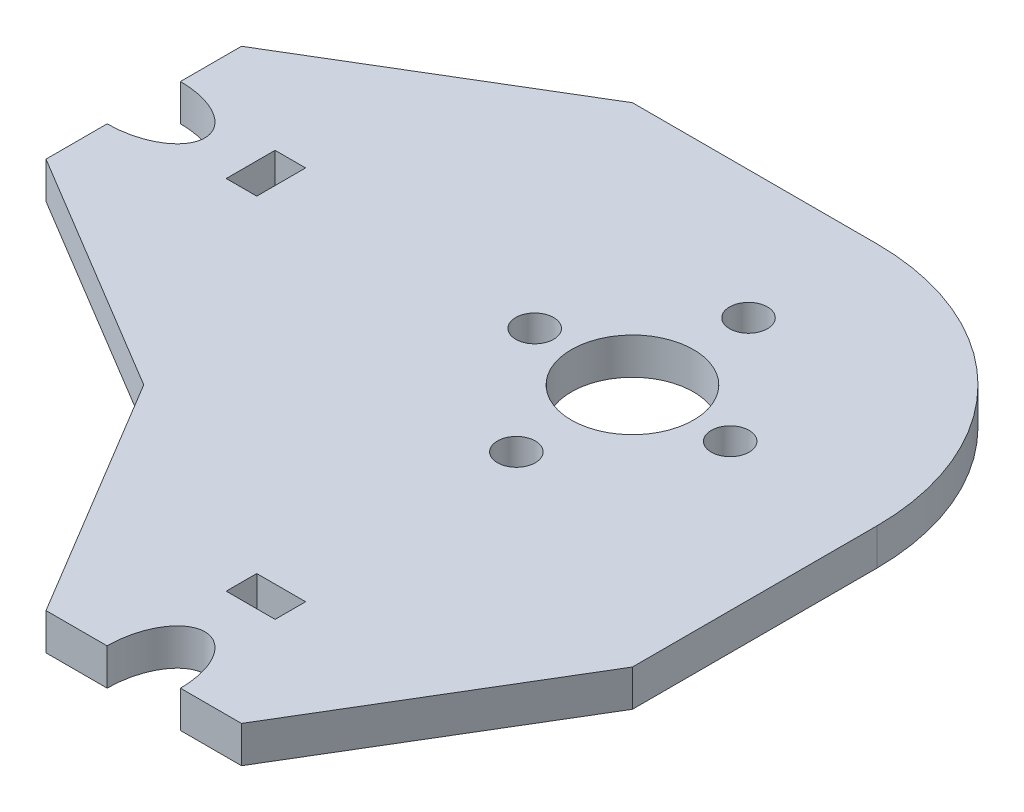
ISO-10303-21;
HEADER;
FILE_DESCRIPTION(('STEP AP214'),'2;1');
FILE_NAME('part.step','',(''),(''),'','','');
FILE_SCHEMA(('AUTOMOTIVE_DESIGN { 1 0 10303 214 1 1 1 1 }'));
ENDSEC;
DATA;
#1=APPLICATION_CONTEXT('core data for automotive mechanical design processes');
#2=APPLICATION_PROTOCOL_DEFINITION('international standard','automotive_design',2000,#1);
#3=PRODUCT_CONTEXT('',#1,'mechanical');
#4=PRODUCT('Part','Part','',(#3));
#5=PRODUCT_RELATED_PRODUCT_CATEGORY('part','',(#4));
#6=PRODUCT_DEFINITION_FORMATION('','',#4);
#7=PRODUCT_DEFINITION_CONTEXT('part definition',#1,'design');
#8=PRODUCT_DEFINITION('design','',#6,#7);
#9=PRODUCT_DEFINITION_SHAPE('','',#8);
#10=(LENGTH_UNIT() NAMED_UNIT(*) SI_UNIT(.MILLI.,.METRE.));
#11=(NAMED_UNIT(*) PLANE_ANGLE_UNIT() SI_UNIT($,.RADIAN.));
#12=(NAMED_UNIT(*) SI_UNIT($,.STERADIAN.) SOLID_ANGLE_UNIT());
#13=UNCERTAINTY_MEASURE_WITH_UNIT(LENGTH_MEASURE(1.E-05),#10,'distance_accuracy_value','');
#14=(GEOMETRIC_REPRESENTATION_CONTEXT(3) GLOBAL_UNCERTAINTY_ASSIGNED_CONTEXT((#13)) GLOBAL_UNIT_ASSIGNED_CONTEXT((#10,
#11,#12)) REPRESENTATION_CONTEXT('',''));
#15=CARTESIAN_POINT('',(0.,0.,0.));
#16=DIRECTION('',(0.,0.,1.));
#17=DIRECTION('',(1.,0.,0.));
#18=AXIS2_PLACEMENT_3D('',#15,#16,#17);
#19=CARTESIAN_POINT('',(1.66533453693774E-13,3.,40.));
#20=DIRECTION('',(0.,0.,1.));
#21=DIRECTION('',(1.,0.,0.));
#22=AXIS2_PLACEMENT_3D('',#19,#20,#21);
#23=PLANE('',#22);
#24=DIRECTION('',(-1.,0.,0.));
#25=VECTOR('',#24,1.);
#26=CARTESIAN_POINT('',(1.66533453693774E-13,0.,40.));
#27=LINE('',#26,#25);
#28=CARTESIAN_POINT('',(-2.99999999999982,0.,40.));
#29=VERTEX_POINT('',#28);
#30=CARTESIAN_POINT('',(-7.9999999999998,0.,40.));
#31=VERTEX_POINT('',#30);
#32=EDGE_CURVE('E300',#29,#31,#27,.T.);
#33=ORIENTED_EDGE('',*,*,#32,.F.);
#34=DIRECTION('',(0.,-1.,0.));
#35=VECTOR('',#34,1.);
#36=CARTESIAN_POINT('',(-2.99999999999982,3.,40.));
#37=LINE('',#36,#35);
#38=CARTESIAN_POINT('',(-2.99999999999982,3.,40.));
#39=VERTEX_POINT('',#38);
#40=EDGE_CURVE('E11',#39,#29,#37,.T.);
#41=ORIENTED_EDGE('',*,*,#40,.F.);
#42=DIRECTION('',(-1.,0.,0.));
#43=VECTOR('',#42,1.);
#44=CARTESIAN_POINT('',(1.66533453693774E-13,3.,40.));
#45=LINE('',#44,#43);
#46=CARTESIAN_POINT('',(-7.9999999999998,3.,40.));
#47=VERTEX_POINT('',#46);
#48=EDGE_CURVE('E372',#39,#47,#45,.T.);
#49=ORIENTED_EDGE('',*,*,#48,.T.);
#50=DIRECTION('',(0.,-1.,0.));
#51=VECTOR('',#50,1.);
#52=CARTESIAN_POINT('',(-7.9999999999998,3.,40.));
#53=LINE('',#52,#51);
#54=EDGE_CURVE('E55',#47,#31,#53,.T.);
#55=ORIENTED_EDGE('',*,*,#54,.T.);
#56=EDGE_LOOP('',(#33,#41,#49,#55));
#57=FACE_BOUND('',#56,.T.);
#58=ADVANCED_FACE('F36',(#57),#23,.T.);
#59=CARTESIAN_POINT('',(1.80411241501588E-13,3.,40.));
#60=DIRECTION('',(0.,-1.,0.));
#61=DIRECTION('',(0.,0.,-1.));
#62=AXIS2_PLACEMENT_3D('',#59,#60,#61);
#63=ELLIPSE('',#62,5.,3.);
#64=DIRECTION('',(0.,-1.,0.));
#65=VECTOR('',#64,1.);
#66=SURFACE_OF_LINEAR_EXTRUSION('',#63,#65);
#67=CARTESIAN_POINT('',(1.80411241501588E-13,0.,40.));
#68=DIRECTION('',(0.,-1.,0.));
#69=DIRECTION('',(0.,0.,-1.));
#70=AXIS2_PLACEMENT_3D('',#67,#68,#69);
#71=ELLIPSE('',#70,5.,3.);
#72=CARTESIAN_POINT('',(3.00000000000018,0.,40.));
#73=VERTEX_POINT('',#72);
#74=EDGE_CURVE('E302',#29,#73,#71,.T.);
#75=ORIENTED_EDGE('',*,*,#74,.T.);
#76=DIRECTION('',(0.,-1.,0.));
#77=VECTOR('',#76,1.);
#78=CARTESIAN_POINT('',(3.00000000000018,3.,40.));
#79=LINE('',#78,#77);
#80=CARTESIAN_POINT('',(3.00000000000018,3.,40.));
#81=VERTEX_POINT('',#80);
#82=EDGE_CURVE('E46',#81,#73,#79,.T.);
#83=ORIENTED_EDGE('',*,*,#82,.F.);
#84=EDGE_CURVE('E374',#39,#81,#63,.T.);
#85=ORIENTED_EDGE('',*,*,#84,.F.);
#86=ORIENTED_EDGE('',*,*,#40,.T.);
#87=EDGE_LOOP('',(#75,#83,#85,#86));
#88=FACE_BOUND('',#87,.T.);
#89=ADVANCED_FACE('F381',(#88),#66,.F.);
#90=CARTESIAN_POINT('',(1.11022302462516E-13,3.,40.));
#91=DIRECTION('',(0.,0.,-1.));
#92=DIRECTION('',(-1.,0.,0.));
#93=AXIS2_PLACEMENT_3D('',#90,#91,#92);
#94=PLANE('',#93);
#95=DIRECTION('',(1.,0.,0.));
#96=VECTOR('',#95,1.);
#97=CARTESIAN_POINT('',(1.11022302462516E-13,0.,40.));
#98=LINE('',#97,#96);
#99=CARTESIAN_POINT('',(8.00000000000018,0.,40.));
#100=VERTEX_POINT('',#99);
#101=EDGE_CURVE('E305',#73,#100,#98,.T.);
#102=ORIENTED_EDGE('',*,*,#101,.T.);
#103=DIRECTION('',(0.,-1.,0.));
#104=VECTOR('',#103,1.);
#105=CARTESIAN_POINT('',(8.00000000000018,3.,40.));
#106=LINE('',#105,#104);
#107=CARTESIAN_POINT('',(8.00000000000018,3.,40.));
#108=VERTEX_POINT('',#107);
#109=EDGE_CURVE('E228',#108,#100,#106,.T.);
#110=ORIENTED_EDGE('',*,*,#109,.F.);
#111=DIRECTION('',(1.,0.,0.));
#112=VECTOR('',#111,1.);
#113=CARTESIAN_POINT('',(1.11022302462516E-13,3.,40.));
#114=LINE('',#113,#112);
#115=EDGE_CURVE('E378',#81,#108,#114,.T.);
#116=ORIENTED_EDGE('',*,*,#115,.F.);
#117=ORIENTED_EDGE('',*,*,#82,.T.);
#118=EDGE_LOOP('',(#102,#110,#116,#117));
#119=FACE_BOUND('',#118,.T.);
#120=ADVANCED_FACE('F385',(#119),#94,.F.);
#121=CARTESIAN_POINT('',(23.5294117647059,3.,14.1176470588234));
#122=DIRECTION('',(-0.857492925712546,0.,-0.514495755427523));
#123=DIRECTION('',(-0.514495755427523,0.,0.857492925712547));
#124=AXIS2_PLACEMENT_3D('',#121,#122,#123);
#125=PLANE('',#124);
#126=DIRECTION('',(0.514495755427523,0.,-0.857492925712547));
#127=VECTOR('',#126,1.);
#128=CARTESIAN_POINT('',(23.5294117647059,0.,14.1176470588234));
#129=LINE('',#128,#127);
#130=CARTESIAN_POINT('',(20.0000000000001,0.,19.9999999999999));
#131=VERTEX_POINT('',#130);
#132=EDGE_CURVE('E308',#100,#131,#129,.T.);
#133=ORIENTED_EDGE('',*,*,#132,.T.);
#134=DIRECTION('',(0.,-1.,0.));
#135=VECTOR('',#134,1.);
#136=CARTESIAN_POINT('',(20.0000000000001,3.,19.9999999999999));
#137=LINE('',#136,#135);
#138=CARTESIAN_POINT('',(20.0000000000001,3.,19.9999999999999));
#139=VERTEX_POINT('',#138);
#140=EDGE_CURVE('E225',#139,#131,#137,.T.);
#141=ORIENTED_EDGE('',*,*,#140,.F.);
#142=DIRECTION('',(0.514495755427523,0.,-0.857492925712547));
#143=VECTOR('',#142,1.);
#144=CARTESIAN_POINT('',(23.5294117647059,3.,14.1176470588234));
#145=LINE('',#144,#143);
#146=EDGE_CURVE('E651',#108,#139,#145,.T.);
#147=ORIENTED_EDGE('',*,*,#146,.F.);
#148=ORIENTED_EDGE('',*,*,#109,.T.);
#149=EDGE_LOOP('',(#133,#141,#147,#148));
#150=FACE_BOUND('',#149,.T.);
#151=ADVANCED_FACE('F613',(#150),#125,.F.);
#152=CARTESIAN_POINT('',(20.,3.,0.));
#153=DIRECTION('',(-1.,0.,0.));
#154=DIRECTION('',(0.,0.,1.));
#155=AXIS2_PLACEMENT_3D('',#152,#153,#154);
#156=PLANE('',#155);
#157=DIRECTION('',(0.,0.,-1.));
#158=VECTOR('',#157,1.);
#159=CARTESIAN_POINT('',(20.,0.,0.));
#160=LINE('',#159,#158);
#161=CARTESIAN_POINT('',(20.,0.,0.));
#162=VERTEX_POINT('',#161);
#163=EDGE_CURVE('E311',#131,#162,#160,.T.);
#164=ORIENTED_EDGE('',*,*,#163,.T.);
#165=DIRECTION('',(0.,-1.,0.));
#166=VECTOR('',#165,1.);
#167=CARTESIAN_POINT('',(20.,3.,0.));
#168=LINE('',#167,#166);
#169=CARTESIAN_POINT('',(20.,3.,0.));
#170=VERTEX_POINT('',#169);
#171=EDGE_CURVE('E223',#170,#162,#168,.T.);
#172=ORIENTED_EDGE('',*,*,#171,.F.);
#173=DIRECTION('',(0.,0.,-1.));
#174=VECTOR('',#173,1.);
#175=CARTESIAN_POINT('',(20.,3.,0.));
#176=LINE('',#175,#174);
#177=EDGE_CURVE('E653',#139,#170,#176,.T.);
#178=ORIENTED_EDGE('',*,*,#177,.F.);
#179=ORIENTED_EDGE('',*,*,#140,.T.);
#180=EDGE_LOOP('',(#164,#172,#178,#179));
#181=FACE_BOUND('',#180,.T.);
#182=ADVANCED_FACE('F603',(#181),#156,.F.);
#183=CARTESIAN_POINT('',(0.,3.,0.));
#184=DIRECTION('',(0.,-1.,0.));
#185=DIRECTION('',(0.,0.,-1.));
#186=AXIS2_PLACEMENT_3D('',#183,#184,#185);
#187=CYLINDRICAL_SURFACE('',#186,20.);
#188=CARTESIAN_POINT('',(0.,0.,0.));
#189=DIRECTION('',(0.,1.,0.));
#190=DIRECTION('',(0.,0.,1.));
#191=AXIS2_PLACEMENT_3D('',#188,#189,#190);
#192=CIRCLE('',#191,20.);
#193=CARTESIAN_POINT('',(0.,0.,-20.));
#194=VERTEX_POINT('',#193);
#195=EDGE_CURVE('E314',#194,#162,#192,.F.);
#196=ORIENTED_EDGE('',*,*,#195,.F.);
#197=DIRECTION('',(0.,-1.,0.));
#198=VECTOR('',#197,1.);
#199=CARTESIAN_POINT('',(0.,3.,-20.));
#200=LINE('',#199,#198);
#201=CARTESIAN_POINT('',(0.,3.,-20.));
#202=VERTEX_POINT('',#201);
#203=EDGE_CURVE('E221',#202,#194,#200,.T.);
#204=ORIENTED_EDGE('',*,*,#203,.F.);
#205=CARTESIAN_POINT('',(0.,3.,0.));
#206=DIRECTION('',(0.,1.,0.));
#207=DIRECTION('',(0.,0.,1.));
#208=AXIS2_PLACEMENT_3D('',#205,#206,#207);
#209=CIRCLE('',#208,20.);
#210=EDGE_CURVE('E671',#202,#170,#209,.F.);
#211=ORIENTED_EDGE('',*,*,#210,.T.);
#212=ORIENTED_EDGE('',*,*,#171,.T.);
#213=EDGE_LOOP('',(#196,#204,#211,#212));
#214=FACE_BOUND('',#213,.T.);
#215=ADVANCED_FACE('F593',(#214),#187,.T.);
#216=CARTESIAN_POINT('',(0.,3.,-20.));
#217=DIRECTION('',(0.,0.,-1.));
#218=DIRECTION('',(-1.,0.,0.));
#219=AXIS2_PLACEMENT_3D('',#216,#217,#218);
#220=PLANE('',#219);
#221=DIRECTION('',(1.,0.,0.));
#222=VECTOR('',#221,1.);
#223=CARTESIAN_POINT('',(0.,0.,-20.));
#224=LINE('',#223,#222);
#225=CARTESIAN_POINT('',(-20.,0.,-20.));
#226=VERTEX_POINT('',#225);
#227=EDGE_CURVE('E317',#226,#194,#224,.T.);
#228=ORIENTED_EDGE('',*,*,#227,.F.);
#229=DIRECTION('',(0.,-1.,0.));
#230=VECTOR('',#229,1.);
#231=CARTESIAN_POINT('',(-20.,3.,-20.));
#232=LINE('',#231,#230);
#233=CARTESIAN_POINT('',(-20.,3.,-20.));
#234=VERTEX_POINT('',#233);
#235=EDGE_CURVE('E219',#234,#226,#232,.T.);
#236=ORIENTED_EDGE('',*,*,#235,.F.);
#237=DIRECTION('',(1.,0.,0.));
#238=VECTOR('',#237,1.);
#239=CARTESIAN_POINT('',(0.,3.,-20.));
#240=LINE('',#239,#238);
#241=EDGE_CURVE('E668',#234,#202,#240,.T.);
#242=ORIENTED_EDGE('',*,*,#241,.T.);
#243=ORIENTED_EDGE('',*,*,#203,.T.);
#244=EDGE_LOOP('',(#228,#236,#242,#243));
#245=FACE_BOUND('',#244,.T.);
#246=ADVANCED_FACE('F582',(#245),#220,.T.);
#247=CARTESIAN_POINT('',(-14.1176470588235,3.,-23.5294117647059));
#248=DIRECTION('',(-0.514495755427527,0.,-0.857492925712544));
#249=DIRECTION('',(-0.857492925712544,0.,0.514495755427527));
#250=AXIS2_PLACEMENT_3D('',#247,#248,#249);
#251=PLANE('',#250);
#252=DIRECTION('',(0.857492925712544,0.,-0.514495755427527));
#253=VECTOR('',#252,1.);
#254=CARTESIAN_POINT('',(-14.1176470588235,0.,-23.5294117647059));
#255=LINE('',#254,#253);
#256=CARTESIAN_POINT('',(-40.,0.,-8.));
#257=VERTEX_POINT('',#256);
#258=EDGE_CURVE('E320',#257,#226,#255,.T.);
#259=ORIENTED_EDGE('',*,*,#258,.F.);
#260=DIRECTION('',(0.,-1.,0.));
#261=VECTOR('',#260,1.);
#262=CARTESIAN_POINT('',(-40.,3.,-8.));
#263=LINE('',#262,#261);
#264=CARTESIAN_POINT('',(-40.,3.,-8.));
#265=VERTEX_POINT('',#264);
#266=EDGE_CURVE('E217',#265,#257,#263,.T.);
#267=ORIENTED_EDGE('',*,*,#266,.F.);
#268=DIRECTION('',(0.857492925712544,0.,-0.514495755427527));
#269=VECTOR('',#268,1.);
#270=CARTESIAN_POINT('',(-14.1176470588235,3.,-23.5294117647059));
#271=LINE('',#270,#269);
#272=EDGE_CURVE('E665',#265,#234,#271,.T.);
#273=ORIENTED_EDGE('',*,*,#272,.T.);
#274=ORIENTED_EDGE('',*,*,#235,.T.);
#275=EDGE_LOOP('',(#259,#267,#273,#274));
#276=FACE_BOUND('',#275,.T.);
#277=ADVANCED_FACE('F571',(#276),#251,.T.);
#278=CARTESIAN_POINT('',(-40.,3.,0.));
#279=DIRECTION('',(-1.,0.,0.));
#280=DIRECTION('',(0.,0.,1.));
#281=AXIS2_PLACEMENT_3D('',#278,#279,#280);
#282=PLANE('',#281);
#283=DIRECTION('',(0.,0.,-1.));
#284=VECTOR('',#283,1.);
#285=CARTESIAN_POINT('',(-40.,0.,0.));
#286=LINE('',#285,#284);
#287=CARTESIAN_POINT('',(-40.,0.,-3.));
#288=VERTEX_POINT('',#287);
#289=EDGE_CURVE('E323',#288,#257,#286,.T.);
#290=ORIENTED_EDGE('',*,*,#289,.F.);
#291=DIRECTION('',(0.,-1.,0.));
#292=VECTOR('',#291,1.);
#293=CARTESIAN_POINT('',(-40.,3.,-3.));
#294=LINE('',#293,#292);
#295=CARTESIAN_POINT('',(-40.,3.,-3.));
#296=VERTEX_POINT('',#295);
#297=EDGE_CURVE('E211',#296,#288,#294,.T.);
#298=ORIENTED_EDGE('',*,*,#297,.F.);
#299=DIRECTION('',(0.,0.,-1.));
#300=VECTOR('',#299,1.);
#301=CARTESIAN_POINT('',(-40.,3.,0.));
#302=LINE('',#301,#300);
#303=EDGE_CURVE('E662',#296,#265,#302,.T.);
#304=ORIENTED_EDGE('',*,*,#303,.T.);
#305=ORIENTED_EDGE('',*,*,#266,.T.);
#306=EDGE_LOOP('',(#290,#298,#304,#305));
#307=FACE_BOUND('',#306,.T.);
#308=ADVANCED_FACE('F561',(#307),#282,.T.);
#309=CARTESIAN_POINT('',(-40.,3.,0.));
#310=DIRECTION('',(0.,1.,0.));
#311=DIRECTION('',(1.,0.,0.));
#312=AXIS2_PLACEMENT_3D('',#309,#310,#311);
#313=ELLIPSE('',#312,5.,3.);
#314=DIRECTION('',(0.,-1.,0.));
#315=VECTOR('',#314,1.);
#316=SURFACE_OF_LINEAR_EXTRUSION('',#313,#315);
#317=CARTESIAN_POINT('',(-40.,0.,0.));
#318=DIRECTION('',(0.,1.,0.));
#319=DIRECTION('',(1.,0.,0.));
#320=AXIS2_PLACEMENT_3D('',#317,#318,#319);
#321=ELLIPSE('',#320,5.,3.);
#322=CARTESIAN_POINT('',(-40.,0.,3.));
#323=VERTEX_POINT('',#322);
#324=EDGE_CURVE('E326',#323,#288,#321,.T.);
#325=ORIENTED_EDGE('',*,*,#324,.F.);
#326=DIRECTION('',(0.,-1.,0.));
#327=VECTOR('',#326,1.);
#328=CARTESIAN_POINT('',(-40.,3.,3.));
#329=LINE('',#328,#327);
#330=CARTESIAN_POINT('',(-40.,3.,3.));
#331=VERTEX_POINT('',#330);
#332=EDGE_CURVE('E209',#331,#323,#329,.T.);
#333=ORIENTED_EDGE('',*,*,#332,.F.);
#334=EDGE_CURVE('E203',#331,#296,#313,.T.);
#335=ORIENTED_EDGE('',*,*,#334,.T.);
#336=ORIENTED_EDGE('',*,*,#297,.T.);
#337=EDGE_LOOP('',(#325,#333,#335,#336));
#338=FACE_BOUND('',#337,.T.);
#339=ADVANCED_FACE('F551',(#338),#316,.T.);
#340=CARTESIAN_POINT('',(-40.,3.,0.));
#341=DIRECTION('',(1.,0.,0.));
#342=DIRECTION('',(0.,0.,-1.));
#343=AXIS2_PLACEMENT_3D('',#340,#341,#342);
#344=PLANE('',#343);
#345=DIRECTION('',(0.,0.,1.));
#346=VECTOR('',#345,1.);
#347=CARTESIAN_POINT('',(-40.,0.,0.));
#348=LINE('',#347,#346);
#349=CARTESIAN_POINT('',(-40.,0.,8.));
#350=VERTEX_POINT('',#349);
#351=EDGE_CURVE('E208',#323,#350,#348,.T.);
#352=ORIENTED_EDGE('',*,*,#351,.T.);
#353=DIRECTION('',(0.,-1.,0.));
#354=VECTOR('',#353,1.);
#355=CARTESIAN_POINT('',(-40.,3.,8.));
#356=LINE('',#355,#354);
#357=CARTESIAN_POINT('',(-40.,3.,8.));
#358=VERTEX_POINT('',#357);
#359=EDGE_CURVE('E190',#358,#350,#356,.T.);
#360=ORIENTED_EDGE('',*,*,#359,.F.);
#361=DIRECTION('',(0.,0.,1.));
#362=VECTOR('',#361,1.);
#363=CARTESIAN_POINT('',(-40.,3.,0.));
#364=LINE('',#363,#362);
#365=EDGE_CURVE('E195',#331,#358,#364,.T.);
#366=ORIENTED_EDGE('',*,*,#365,.F.);
#367=ORIENTED_EDGE('',*,*,#332,.T.);
#368=EDGE_LOOP('',(#352,#360,#366,#367));
#369=FACE_BOUND('',#368,.T.);
#370=ADVANCED_FACE('F206',(#369),#344,.F.);
#371=CARTESIAN_POINT('',(-14.1176470588235,3.,23.5294117647059));
#372=DIRECTION('',(0.514495755427527,0.,-0.857492925712544));
#373=DIRECTION('',(-0.857492925712544,0.,-0.514495755427527));
#374=AXIS2_PLACEMENT_3D('',#371,#372,#373);
#375=PLANE('',#374);
#376=DIRECTION('',(0.857492925712544,0.,0.514495755427527));
#377=VECTOR('',#376,1.);
#378=CARTESIAN_POINT('',(-14.1176470588235,0.,23.5294117647059));
#379=LINE('',#378,#377);
#380=CARTESIAN_POINT('',(-20.,0.,20.));
#381=VERTEX_POINT('',#380);
#382=EDGE_CURVE('E330',#350,#381,#379,.T.);
#383=ORIENTED_EDGE('',*,*,#382,.T.);
#384=DIRECTION('',(0.,-1.,0.));
#385=VECTOR('',#384,1.);
#386=CARTESIAN_POINT('',(-20.,3.,20.));
#387=LINE('',#386,#385);
#388=CARTESIAN_POINT('',(-20.,3.,20.));
#389=VERTEX_POINT('',#388);
#390=EDGE_CURVE('E120',#389,#381,#387,.T.);
#391=ORIENTED_EDGE('',*,*,#390,.F.);
#392=DIRECTION('',(0.857492925712544,0.,0.514495755427527));
#393=VECTOR('',#392,1.);
#394=CARTESIAN_POINT('',(-14.1176470588235,3.,23.5294117647059));
#395=LINE('',#394,#393);
#396=EDGE_CURVE('E186',#358,#389,#395,.T.);
#397=ORIENTED_EDGE('',*,*,#396,.F.);
#398=ORIENTED_EDGE('',*,*,#359,.T.);
#399=EDGE_LOOP('',(#383,#391,#397,#398));
#400=FACE_BOUND('',#399,.T.);
#401=ADVANCED_FACE('F188',(#400),#375,.F.);
#402=CARTESIAN_POINT('',(1.99999999999997,3.,0.));
#403=DIRECTION('',(-1.,0.,0.));
#404=DIRECTION('',(0.,0.,1.));
#405=AXIS2_PLACEMENT_3D('',#402,#403,#404);
#406=PLANE('',#405);
#407=DIRECTION('',(0.,0.,-1.));
#408=VECTOR('',#407,1.);
#409=CARTESIAN_POINT('',(1.99999999999997,0.,0.));
#410=LINE('',#409,#408);
#411=CARTESIAN_POINT('',(2.00000000000014,0.,31.25));
#412=VERTEX_POINT('',#411);
#413=CARTESIAN_POINT('',(2.00000000000013,0.,28.75));
#414=VERTEX_POINT('',#413);
#415=EDGE_CURVE('E276',#412,#414,#410,.T.);
#416=ORIENTED_EDGE('',*,*,#415,.F.);
#417=DIRECTION('',(0.,-1.,0.));
#418=VECTOR('',#417,1.);
#419=CARTESIAN_POINT('',(2.00000000000014,3.,31.25));
#420=LINE('',#419,#418);
#421=CARTESIAN_POINT('',(2.00000000000014,3.,31.25));
#422=VERTEX_POINT('',#421);
#423=EDGE_CURVE('E240',#422,#412,#420,.T.);
#424=ORIENTED_EDGE('',*,*,#423,.F.);
#425=DIRECTION('',(0.,0.,-1.));
#426=VECTOR('',#425,1.);
#427=CARTESIAN_POINT('',(1.99999999999997,3.,0.));
#428=LINE('',#427,#426);
#429=CARTESIAN_POINT('',(2.00000000000013,3.,28.75));
#430=VERTEX_POINT('',#429);
#431=EDGE_CURVE('E349',#422,#430,#428,.T.);
#432=ORIENTED_EDGE('',*,*,#431,.T.);
#433=DIRECTION('',(0.,-1.,0.));
#434=VECTOR('',#433,1.);
#435=CARTESIAN_POINT('',(2.00000000000013,3.,28.75));
#436=LINE('',#435,#434);
#437=EDGE_CURVE('E233',#430,#414,#436,.T.);
#438=ORIENTED_EDGE('',*,*,#437,.T.);
#439=EDGE_LOOP('',(#416,#424,#432,#438));
#440=FACE_BOUND('',#439,.T.);
#441=ADVANCED_FACE('F419',(#440),#406,.T.);
#442=CARTESIAN_POINT('',(1.62630325872826E-13,3.,31.25));
#443=DIRECTION('',(0.,0.,-1.));
#444=DIRECTION('',(-1.,0.,0.));
#445=AXIS2_PLACEMENT_3D('',#442,#443,#444);
#446=PLANE('',#445);
#447=DIRECTION('',(1.,0.,0.));
#448=VECTOR('',#447,1.);
#449=CARTESIAN_POINT('',(1.62630325872826E-13,0.,31.25));
#450=LINE('',#449,#448);
#451=CARTESIAN_POINT('',(-1.99999999999986,0.,31.25));
#452=VERTEX_POINT('',#451);
#453=EDGE_CURVE('E279',#452,#412,#450,.T.);
#454=ORIENTED_EDGE('',*,*,#453,.F.);
#455=DIRECTION('',(0.,-1.,0.));
#456=VECTOR('',#455,1.);
#457=CARTESIAN_POINT('',(-1.99999999999986,3.,31.25));
#458=LINE('',#457,#456);
#459=CARTESIAN_POINT('',(-1.99999999999986,3.,31.25));
#460=VERTEX_POINT('',#459);
#461=EDGE_CURVE('E238',#460,#452,#458,.T.);
#462=ORIENTED_EDGE('',*,*,#461,.F.);
#463=DIRECTION('',(1.,0.,0.));
#464=VECTOR('',#463,1.);
#465=CARTESIAN_POINT('',(1.62630325872826E-13,3.,31.25));
#466=LINE('',#465,#464);
#467=EDGE_CURVE('E352',#460,#422,#466,.T.);
#468=ORIENTED_EDGE('',*,*,#467,.T.);
#469=ORIENTED_EDGE('',*,*,#423,.T.);
#470=EDGE_LOOP('',(#454,#462,#468,#469));
#471=FACE_BOUND('',#470,.T.);
#472=ADVANCED_FACE('F415',(#471),#446,.T.);
#473=CARTESIAN_POINT('',(-2.00000000000003,3.,0.));
#474=DIRECTION('',(-1.,0.,0.));
#475=DIRECTION('',(0.,0.,1.));
#476=AXIS2_PLACEMENT_3D('',#473,#474,#475);
#477=PLANE('',#476);
#478=DIRECTION('',(0.,0.,-1.));
#479=VECTOR('',#478,1.);
#480=CARTESIAN_POINT('',(-2.00000000000003,0.,0.));
#481=LINE('',#480,#479);
#482=CARTESIAN_POINT('',(-1.99999999999987,0.,28.75));
#483=VERTEX_POINT('',#482);
#484=EDGE_CURVE('E282',#452,#483,#481,.T.);
#485=ORIENTED_EDGE('',*,*,#484,.T.);
#486=DIRECTION('',(0.,-1.,0.));
#487=VECTOR('',#486,1.);
#488=CARTESIAN_POINT('',(-1.99999999999987,3.,28.75));
#489=LINE('',#488,#487);
#490=CARTESIAN_POINT('',(-1.99999999999987,3.,28.75));
#491=VERTEX_POINT('',#490);
#492=EDGE_CURVE('E235',#491,#483,#489,.T.);
#493=ORIENTED_EDGE('',*,*,#492,.F.);
#494=DIRECTION('',(0.,0.,-1.));
#495=VECTOR('',#494,1.);
#496=CARTESIAN_POINT('',(-2.00000000000003,3.,0.));
#497=LINE('',#496,#495);
#498=EDGE_CURVE('E355',#460,#491,#497,.T.);
#499=ORIENTED_EDGE('',*,*,#498,.F.);
#500=ORIENTED_EDGE('',*,*,#461,.T.);
#501=EDGE_LOOP('',(#485,#493,#499,#500));
#502=FACE_BOUND('',#501,.T.);
#503=ADVANCED_FACE('F412',(#502),#477,.F.);
#504=CARTESIAN_POINT('',(-28.75,3.,0.));
#505=DIRECTION('',(-1.,0.,0.));
#506=DIRECTION('',(0.,0.,1.));
#507=AXIS2_PLACEMENT_3D('',#504,#505,#506);
#508=PLANE('',#507);
#509=DIRECTION('',(0.,0.,-1.));
#510=VECTOR('',#509,1.);
#511=CARTESIAN_POINT('',(-28.75,0.,0.));
#512=LINE('',#511,#510);
#513=CARTESIAN_POINT('',(-28.75,0.,2.));
#514=VERTEX_POINT('',#513);
#515=CARTESIAN_POINT('',(-28.75,0.,-2.));
#516=VERTEX_POINT('',#515);
#517=EDGE_CURVE('E260',#514,#516,#512,.T.);
#518=ORIENTED_EDGE('',*,*,#517,.F.);
#519=DIRECTION('',(0.,-1.,0.));
#520=VECTOR('',#519,1.);
#521=CARTESIAN_POINT('',(-28.75,3.,2.));
#522=LINE('',#521,#520);
#523=CARTESIAN_POINT('',(-28.75,3.,2.));
#524=VERTEX_POINT('',#523);
#525=EDGE_CURVE('E40',#524,#514,#522,.T.);
#526=ORIENTED_EDGE('',*,*,#525,.F.);
#527=DIRECTION('',(0.,0.,-1.));
#528=VECTOR('',#527,1.);
#529=CARTESIAN_POINT('',(-28.75,3.,0.));
#530=LINE('',#529,#528);
#531=CARTESIAN_POINT('',(-28.75,3.,-2.));
#532=VERTEX_POINT('',#531);
#533=EDGE_CURVE('E337',#524,#532,#530,.T.);
#534=ORIENTED_EDGE('',*,*,#533,.T.);
#535=DIRECTION('',(0.,-1.,0.));
#536=VECTOR('',#535,1.);
#537=CARTESIAN_POINT('',(-28.75,3.,-2.));
#538=LINE('',#537,#536);
#539=EDGE_CURVE('E242',#532,#516,#538,.T.);
#540=ORIENTED_EDGE('',*,*,#539,.T.);
#541=EDGE_LOOP('',(#518,#526,#534,#540));
#542=FACE_BOUND('',#541,.T.);
#543=ADVANCED_FACE('F261',(#542),#508,.T.);
#544=CARTESIAN_POINT('',(0.,3.,2.));
#545=DIRECTION('',(0.,0.,-1.));
#546=DIRECTION('',(-1.,0.,0.));
#547=AXIS2_PLACEMENT_3D('',#544,#545,#546);
#548=PLANE('',#547);
#549=DIRECTION('',(1.,0.,0.));
#550=VECTOR('',#549,1.);
#551=CARTESIAN_POINT('',(0.,0.,2.));
#552=LINE('',#551,#550);
#553=CARTESIAN_POINT('',(-31.25,0.,2.));
#554=VERTEX_POINT('',#553);
#555=EDGE_CURVE('E256',#554,#514,#552,.T.);
#556=ORIENTED_EDGE('',*,*,#555,.F.);
#557=DIRECTION('',(0.,-1.,0.));
#558=VECTOR('',#557,1.);
#559=CARTESIAN_POINT('',(-31.25,3.,2.));
#560=LINE('',#559,#558);
#561=CARTESIAN_POINT('',(-31.25,3.,2.));
#562=VERTEX_POINT('',#561);
#563=EDGE_CURVE('E246',#562,#554,#560,.T.);
#564=ORIENTED_EDGE('',*,*,#563,.F.);
#565=DIRECTION('',(1.,0.,0.));
#566=VECTOR('',#565,1.);
#567=CARTESIAN_POINT('',(0.,3.,2.));
#568=LINE('',#567,#566);
#569=EDGE_CURVE('E258',#562,#524,#568,.T.);
#570=ORIENTED_EDGE('',*,*,#569,.T.);
#571=ORIENTED_EDGE('',*,*,#525,.T.);
#572=EDGE_LOOP('',(#556,#564,#570,#571));
#573=FACE_BOUND('',#572,.T.);
#574=ADVANCED_FACE('F254',(#573),#548,.T.);
#575=CARTESIAN_POINT('',(-31.25,3.,0.));
#576=DIRECTION('',(-1.,0.,0.));
#577=DIRECTION('',(0.,0.,1.));
#578=AXIS2_PLACEMENT_3D('',#575,#576,#577);
#579=PLANE('',#578);
#580=DIRECTION('',(0.,0.,-1.));
#581=VECTOR('',#580,1.);
#582=CARTESIAN_POINT('',(-31.25,0.,0.));
#583=LINE('',#582,#581);
#584=CARTESIAN_POINT('',(-31.25,0.,-2.));
#585=VERTEX_POINT('',#584);
#586=EDGE_CURVE('E269',#554,#585,#583,.T.);
#587=ORIENTED_EDGE('',*,*,#586,.T.);
#588=DIRECTION('',(0.,-1.,0.));
#589=VECTOR('',#588,1.);
#590=CARTESIAN_POINT('',(-31.25,3.,-2.));
#591=LINE('',#590,#589);
#592=CARTESIAN_POINT('',(-31.25,3.,-2.));
#593=VERTEX_POINT('',#592);
#594=EDGE_CURVE('E244',#593,#585,#591,.T.);
#595=ORIENTED_EDGE('',*,*,#594,.F.);
#596=DIRECTION('',(0.,0.,-1.));
#597=VECTOR('',#596,1.);
#598=CARTESIAN_POINT('',(-31.25,3.,0.));
#599=LINE('',#598,#597);
#600=EDGE_CURVE('E344',#562,#593,#599,.T.);
#601=ORIENTED_EDGE('',*,*,#600,.F.);
#602=ORIENTED_EDGE('',*,*,#563,.T.);
#603=EDGE_LOOP('',(#587,#595,#601,#602));
#604=FACE_BOUND('',#603,.T.);
#605=ADVANCED_FACE('F394',(#604),#579,.F.);
#606=CARTESIAN_POINT('',(-8.,3.,0.));
#607=DIRECTION('',(0.,-1.,0.));
#608=DIRECTION('',(0.,0.,-1.));
#609=AXIS2_PLACEMENT_3D('',#606,#607,#608);
#610=CYLINDRICAL_SURFACE('',#609,1.55);
#611=CARTESIAN_POINT('',(-8.,3.,0.));
#612=DIRECTION('',(0.,1.,0.));
#613=DIRECTION('',(0.,0.,1.));
#614=AXIS2_PLACEMENT_3D('',#611,#612,#613);
#615=CIRCLE('',#614,1.55);
#616=CARTESIAN_POINT('',(-8.,3.,1.55));
#617=VERTEX_POINT('',#616);
#618=EDGE_CURVE('E369',#617,#617,#615,.F.);
#619=ORIENTED_EDGE('',*,*,#618,.F.);
#620=EDGE_LOOP('',(#619));
#621=FACE_BOUND('',#620,.T.);
#622=CARTESIAN_POINT('',(-8.,0.,0.));
#623=DIRECTION('',(0.,1.,0.));
#624=DIRECTION('',(0.,0.,1.));
#625=AXIS2_PLACEMENT_3D('',#622,#623,#624);
#626=CIRCLE('',#625,1.55);
#627=CARTESIAN_POINT('',(-8.,0.,1.55));
#628=VERTEX_POINT('',#627);
#629=EDGE_CURVE('E297',#628,#628,#626,.F.);
#630=ORIENTED_EDGE('',*,*,#629,.T.);
#631=EDGE_LOOP('',(#630));
#632=FACE_BOUND('',#631,.T.);
#633=ADVANCED_FACE('F390',(#621,#632),#610,.F.);
#634=CARTESIAN_POINT('',(0.,3.,9.5));
#635=DIRECTION('',(0.,-1.,0.));
#636=DIRECTION('',(0.,0.,-1.));
#637=AXIS2_PLACEMENT_3D('',#634,#635,#636);
#638=CYLINDRICAL_SURFACE('',#637,1.55);
#639=CARTESIAN_POINT('',(0.,3.,9.5));
#640=DIRECTION('',(0.,1.,0.));
#641=DIRECTION('',(0.,0.,1.));
#642=AXIS2_PLACEMENT_3D('',#639,#640,#641);
#643=CIRCLE('',#642,1.55);
#644=CARTESIAN_POINT('',(0.,3.,11.05));
#645=VERTEX_POINT('',#644);
#646=EDGE_CURVE('E366',#645,#645,#643,.T.);
#647=ORIENTED_EDGE('',*,*,#646,.T.);
#648=EDGE_LOOP('',(#647));
#649=FACE_BOUND('',#648,.T.);
#650=CARTESIAN_POINT('',(0.,0.,9.5));
#651=DIRECTION('',(0.,1.,0.));
#652=DIRECTION('',(0.,0.,1.));
#653=AXIS2_PLACEMENT_3D('',#650,#651,#652);
#654=CIRCLE('',#653,1.55);
#655=CARTESIAN_POINT('',(0.,0.,11.05));
#656=VERTEX_POINT('',#655);
#657=EDGE_CURVE('E294',#656,#656,#654,.T.);
#658=ORIENTED_EDGE('',*,*,#657,.F.);
#659=EDGE_LOOP('',(#658));
#660=FACE_BOUND('',#659,.T.);
#661=ADVANCED_FACE('F393',(#649,#660),#638,.F.);
#662=CARTESIAN_POINT('',(8.,3.,0.));
#663=DIRECTION('',(0.,-1.,0.));
#664=DIRECTION('',(0.,0.,-1.));
#665=AXIS2_PLACEMENT_3D('',#662,#663,#664);
#666=CYLINDRICAL_SURFACE('',#665,1.55);
#667=CARTESIAN_POINT('',(8.,3.,0.));
#668=DIRECTION('',(0.,1.,0.));
#669=DIRECTION('',(0.,0.,1.));
#670=AXIS2_PLACEMENT_3D('',#667,#668,#669);
#671=CIRCLE('',#670,1.55);
#672=CARTESIAN_POINT('',(8.,3.,1.55));
#673=VERTEX_POINT('',#672);
#674=EDGE_CURVE('E363',#673,#673,#671,.T.);
#675=ORIENTED_EDGE('',*,*,#674,.T.);
#676=EDGE_LOOP('',(#675));
#677=FACE_BOUND('',#676,.T.);
#678=CARTESIAN_POINT('',(8.,0.,0.));
#679=DIRECTION('',(0.,1.,0.));
#680=DIRECTION('',(0.,0.,1.));
#681=AXIS2_PLACEMENT_3D('',#678,#679,#680);
#682=CIRCLE('',#681,1.55);
#683=CARTESIAN_POINT('',(8.,0.,1.55));
#684=VERTEX_POINT('',#683);
#685=EDGE_CURVE('E291',#684,#684,#682,.T.);
#686=ORIENTED_EDGE('',*,*,#685,.F.);
#687=EDGE_LOOP('',(#686));
#688=FACE_BOUND('',#687,.T.);
#689=ADVANCED_FACE('F398',(#677,#688),#666,.F.);
#690=CARTESIAN_POINT('',(0.,3.,0.));
#691=DIRECTION('',(0.,-1.,0.));
#692=DIRECTION('',(0.,0.,-1.));
#693=AXIS2_PLACEMENT_3D('',#690,#691,#692);
#694=CYLINDRICAL_SURFACE('',#693,5.);
#695=CARTESIAN_POINT('',(0.,3.,0.));
#696=DIRECTION('',(0.,1.,0.));
#697=DIRECTION('',(0.,0.,1.));
#698=AXIS2_PLACEMENT_3D('',#695,#696,#697);
#699=CIRCLE('',#698,5.);
#700=CARTESIAN_POINT('',(0.,3.,5.));
#701=VERTEX_POINT('',#700);
#702=EDGE_CURVE('E360',#701,#701,#699,.T.);
#703=ORIENTED_EDGE('',*,*,#702,.T.);
#704=EDGE_LOOP('',(#703));
#705=FACE_BOUND('',#704,.T.);
#706=CARTESIAN_POINT('',(0.,0.,0.));
#707=DIRECTION('',(0.,1.,0.));
#708=DIRECTION('',(0.,0.,1.));
#709=AXIS2_PLACEMENT_3D('',#706,#707,#708);
#710=CIRCLE('',#709,5.);
#711=CARTESIAN_POINT('',(0.,0.,5.));
#712=VERTEX_POINT('',#711);
#713=EDGE_CURVE('E288',#712,#712,#710,.T.);
#714=ORIENTED_EDGE('',*,*,#713,.F.);
#715=EDGE_LOOP('',(#714));
#716=FACE_BOUND('',#715,.T.);
#717=ADVANCED_FACE('F402',(#705,#716),#694,.F.);
#718=CARTESIAN_POINT('',(0.,3.,28.75));
#719=DIRECTION('',(0.,0.,-1.));
#720=DIRECTION('',(-1.,0.,0.));
#721=AXIS2_PLACEMENT_3D('',#718,#719,#720);
#722=PLANE('',#721);
#723=DIRECTION('',(1.,0.,0.));
#724=VECTOR('',#723,1.);
#725=CARTESIAN_POINT('',(0.,0.,28.75));
#726=LINE('',#725,#724);
#727=EDGE_CURVE('E285',#483,#414,#726,.T.);
#728=ORIENTED_EDGE('',*,*,#727,.T.);
#729=ORIENTED_EDGE('',*,*,#437,.F.);
#730=DIRECTION('',(1.,0.,0.));
#731=VECTOR('',#730,1.);
#732=CARTESIAN_POINT('',(0.,3.,28.75));
#733=LINE('',#732,#731);
#734=EDGE_CURVE('E358',#491,#430,#733,.T.);
#735=ORIENTED_EDGE('',*,*,#734,.F.);
#736=ORIENTED_EDGE('',*,*,#492,.T.);
#737=EDGE_LOOP('',(#728,#729,#735,#736));
#738=FACE_BOUND('',#737,.T.);
#739=ADVANCED_FACE('F406',(#738),#722,.F.);
#740=CARTESIAN_POINT('',(0.,3.,-2.));
#741=DIRECTION('',(0.,0.,-1.));
#742=DIRECTION('',(-1.,0.,0.));
#743=AXIS2_PLACEMENT_3D('',#740,#741,#742);
#744=PLANE('',#743);
#745=DIRECTION('',(1.,0.,0.));
#746=VECTOR('',#745,1.);
#747=CARTESIAN_POINT('',(0.,0.,-2.));
#748=LINE('',#747,#746);
#749=EDGE_CURVE('E271',#585,#516,#748,.T.);
#750=ORIENTED_EDGE('',*,*,#749,.T.);
#751=ORIENTED_EDGE('',*,*,#539,.F.);
#752=DIRECTION('',(1.,0.,0.));
#753=VECTOR('',#752,1.);
#754=CARTESIAN_POINT('',(0.,3.,-2.));
#755=LINE('',#754,#753);
#756=EDGE_CURVE('E347',#593,#532,#755,.T.);
#757=ORIENTED_EDGE('',*,*,#756,.F.);
#758=ORIENTED_EDGE('',*,*,#594,.T.);
#759=EDGE_LOOP('',(#750,#751,#757,#758));
#760=FACE_BOUND('',#759,.T.);
#761=ADVANCED_FACE('F410',(#760),#744,.F.);
#762=CARTESIAN_POINT('',(0.,3.,-9.5));
#763=DIRECTION('',(0.,-1.,0.));
#764=DIRECTION('',(0.,0.,-1.));
#765=AXIS2_PLACEMENT_3D('',#762,#763,#764);
#766=CYLINDRICAL_SURFACE('',#765,1.55);
#767=CARTESIAN_POINT('',(0.,3.,-9.5));
#768=DIRECTION('',(0.,1.,0.));
#769=DIRECTION('',(0.,0.,1.));
#770=AXIS2_PLACEMENT_3D('',#767,#768,#769);
#771=CIRCLE('',#770,1.55);
#772=CARTESIAN_POINT('',(0.,3.,-7.95));
#773=VERTEX_POINT('',#772);
#774=EDGE_CURVE('E334',#773,#773,#771,.F.);
#775=ORIENTED_EDGE('',*,*,#774,.F.);
#776=EDGE_LOOP('',(#775));
#777=FACE_BOUND('',#776,.T.);
#778=CARTESIAN_POINT('',(0.,0.,-9.5));
#779=DIRECTION('',(0.,1.,0.));
#780=DIRECTION('',(0.,0.,1.));
#781=AXIS2_PLACEMENT_3D('',#778,#779,#780);
#782=CIRCLE('',#781,1.55);
#783=CARTESIAN_POINT('',(0.,0.,-7.95));
#784=VERTEX_POINT('',#783);
#785=EDGE_CURVE('E265',#784,#784,#782,.F.);
#786=ORIENTED_EDGE('',*,*,#785,.T.);
#787=EDGE_LOOP('',(#786));
#788=FACE_BOUND('',#787,.T.);
#789=ADVANCED_FACE('F38',(#777,#788),#766,.F.);
#790=CARTESIAN_POINT('',(-23.5294117647058,3.,14.1176470588237));
#791=DIRECTION('',(-0.857492925712541,0.,0.514495755427532));
#792=DIRECTION('',(0.514495755427532,0.,0.857492925712541));
#793=AXIS2_PLACEMENT_3D('',#790,#791,#792);
#794=PLANE('',#793);
#795=DIRECTION('',(-0.514495755427532,0.,-0.857492925712541));
#796=VECTOR('',#795,1.);
#797=CARTESIAN_POINT('',(-23.5294117647058,0.,14.1176470588237));
#798=LINE('',#797,#796);
#799=EDGE_CURVE('E332',#31,#381,#798,.T.);
#800=ORIENTED_EDGE('',*,*,#799,.F.);
#801=ORIENTED_EDGE('',*,*,#54,.F.);
#802=DIRECTION('',(-0.514495755427532,0.,-0.857492925712541));
#803=VECTOR('',#802,1.);
#804=CARTESIAN_POINT('',(-23.5294117647058,3.,14.1176470588237));
#805=LINE('',#804,#803);
#806=EDGE_CURVE('E194',#47,#389,#805,.T.);
#807=ORIENTED_EDGE('',*,*,#806,.T.);
#808=ORIENTED_EDGE('',*,*,#390,.T.);
#809=EDGE_LOOP('',(#800,#801,#807,#808));
#810=FACE_BOUND('',#809,.T.);
#811=ADVANCED_FACE('F473',(#810),#794,.T.);
#812=CARTESIAN_POINT('',(0.,3.,0.));
#813=DIRECTION('',(0.,1.,0.));
#814=DIRECTION('',(0.,0.,1.));
#815=AXIS2_PLACEMENT_3D('',#812,#813,#814);
#816=PLANE('',#815);
#817=ORIENTED_EDGE('',*,*,#774,.T.);
#818=EDGE_LOOP('',(#817));
#819=FACE_BOUND('',#818,.T.);
#820=ORIENTED_EDGE('',*,*,#533,.F.);
#821=ORIENTED_EDGE('',*,*,#569,.F.);
#822=ORIENTED_EDGE('',*,*,#600,.T.);
#823=ORIENTED_EDGE('',*,*,#756,.T.);
#824=EDGE_LOOP('',(#820,#821,#822,#823));
#825=FACE_BOUND('',#824,.T.);
#826=ORIENTED_EDGE('',*,*,#431,.F.);
#827=ORIENTED_EDGE('',*,*,#467,.F.);
#828=ORIENTED_EDGE('',*,*,#498,.T.);
#829=ORIENTED_EDGE('',*,*,#734,.T.);
#830=EDGE_LOOP('',(#826,#827,#828,#829));
#831=FACE_BOUND('',#830,.T.);
#832=ORIENTED_EDGE('',*,*,#702,.F.);
#833=EDGE_LOOP('',(#832));
#834=FACE_BOUND('',#833,.T.);
#835=ORIENTED_EDGE('',*,*,#674,.F.);
#836=EDGE_LOOP('',(#835));
#837=FACE_BOUND('',#836,.T.);
#838=ORIENTED_EDGE('',*,*,#646,.F.);
#839=EDGE_LOOP('',(#838));
#840=FACE_BOUND('',#839,.T.);
#841=ORIENTED_EDGE('',*,*,#618,.T.);
#842=EDGE_LOOP('',(#841));
#843=FACE_BOUND('',#842,.T.);
#844=ORIENTED_EDGE('',*,*,#48,.F.);
#845=ORIENTED_EDGE('',*,*,#84,.T.);
#846=ORIENTED_EDGE('',*,*,#115,.T.);
#847=ORIENTED_EDGE('',*,*,#146,.T.);
#848=ORIENTED_EDGE('',*,*,#177,.T.);
#849=ORIENTED_EDGE('',*,*,#210,.F.);
#850=ORIENTED_EDGE('',*,*,#241,.F.);
#851=ORIENTED_EDGE('',*,*,#272,.F.);
#852=ORIENTED_EDGE('',*,*,#303,.F.);
#853=ORIENTED_EDGE('',*,*,#334,.F.);
#854=ORIENTED_EDGE('',*,*,#365,.T.);
#855=ORIENTED_EDGE('',*,*,#396,.T.);
#856=ORIENTED_EDGE('',*,*,#806,.F.);
#857=EDGE_LOOP('',(#844,#845,#846,#847,#848,#849,#850,#851,#852,#853,#854,#855,#856));
#858=FACE_BOUND('',#857,.T.);
#859=ADVANCED_FACE('F200',(#819,#825,#831,#834,#837,#840,#843,#858),#816,.T.);
#860=CARTESIAN_POINT('',(0.,0.,0.));
#861=DIRECTION('',(0.,1.,0.));
#862=DIRECTION('',(0.,0.,1.));
#863=AXIS2_PLACEMENT_3D('',#860,#861,#862);
#864=PLANE('',#863);
#865=ORIENTED_EDGE('',*,*,#785,.F.);
#866=EDGE_LOOP('',(#865));
#867=FACE_BOUND('',#866,.T.);
#868=ORIENTED_EDGE('',*,*,#517,.T.);
#869=ORIENTED_EDGE('',*,*,#749,.F.);
#870=ORIENTED_EDGE('',*,*,#586,.F.);
#871=ORIENTED_EDGE('',*,*,#555,.T.);
#872=EDGE_LOOP('',(#868,#869,#870,#871));
#873=FACE_BOUND('',#872,.T.);
#874=ORIENTED_EDGE('',*,*,#415,.T.);
#875=ORIENTED_EDGE('',*,*,#727,.F.);
#876=ORIENTED_EDGE('',*,*,#484,.F.);
#877=ORIENTED_EDGE('',*,*,#453,.T.);
#878=EDGE_LOOP('',(#874,#875,#876,#877));
#879=FACE_BOUND('',#878,.T.);
#880=ORIENTED_EDGE('',*,*,#713,.T.);
#881=EDGE_LOOP('',(#880));
#882=FACE_BOUND('',#881,.T.);
#883=ORIENTED_EDGE('',*,*,#685,.T.);
#884=EDGE_LOOP('',(#883));
#885=FACE_BOUND('',#884,.T.);
#886=ORIENTED_EDGE('',*,*,#657,.T.);
#887=EDGE_LOOP('',(#886));
#888=FACE_BOUND('',#887,.T.);
#889=ORIENTED_EDGE('',*,*,#629,.F.);
#890=EDGE_LOOP('',(#889));
#891=FACE_BOUND('',#890,.T.);
#892=ORIENTED_EDGE('',*,*,#32,.T.);
#893=ORIENTED_EDGE('',*,*,#799,.T.);
#894=ORIENTED_EDGE('',*,*,#382,.F.);
#895=ORIENTED_EDGE('',*,*,#351,.F.);
#896=ORIENTED_EDGE('',*,*,#324,.T.);
#897=ORIENTED_EDGE('',*,*,#289,.T.);
#898=ORIENTED_EDGE('',*,*,#258,.T.);
#899=ORIENTED_EDGE('',*,*,#227,.T.);
#900=ORIENTED_EDGE('',*,*,#195,.T.);
#901=ORIENTED_EDGE('',*,*,#163,.F.);
#902=ORIENTED_EDGE('',*,*,#132,.F.);
#903=ORIENTED_EDGE('',*,*,#101,.F.);
#904=ORIENTED_EDGE('',*,*,#74,.F.);
#905=EDGE_LOOP('',(#892,#893,#894,#895,#896,#897,#898,#899,#900,#901,#902,#903,#904));
#906=FACE_BOUND('',#905,.T.);
#907=ADVANCED_FACE('F267',(#867,#873,#879,#882,#885,#888,#891,#906),#864,.F.);
#908=CLOSED_SHELL('',(#58,#89,#120,#151,#182,#215,#246,#277,#308,#339,#370,#401,#441,#472,#503,
#543,#574,#605,#633,#661,#689,#717,#739,#761,#789,#811,#859,#907));
#909=MANIFOLD_SOLID_BREP('B2',#908);
#910=ADVANCED_BREP_SHAPE_REPRESENTATION('',(#18,#909),#14);
#911=SHAPE_DEFINITION_REPRESENTATION(#9,#910);
ENDSEC;
END-ISO-10303-21;
